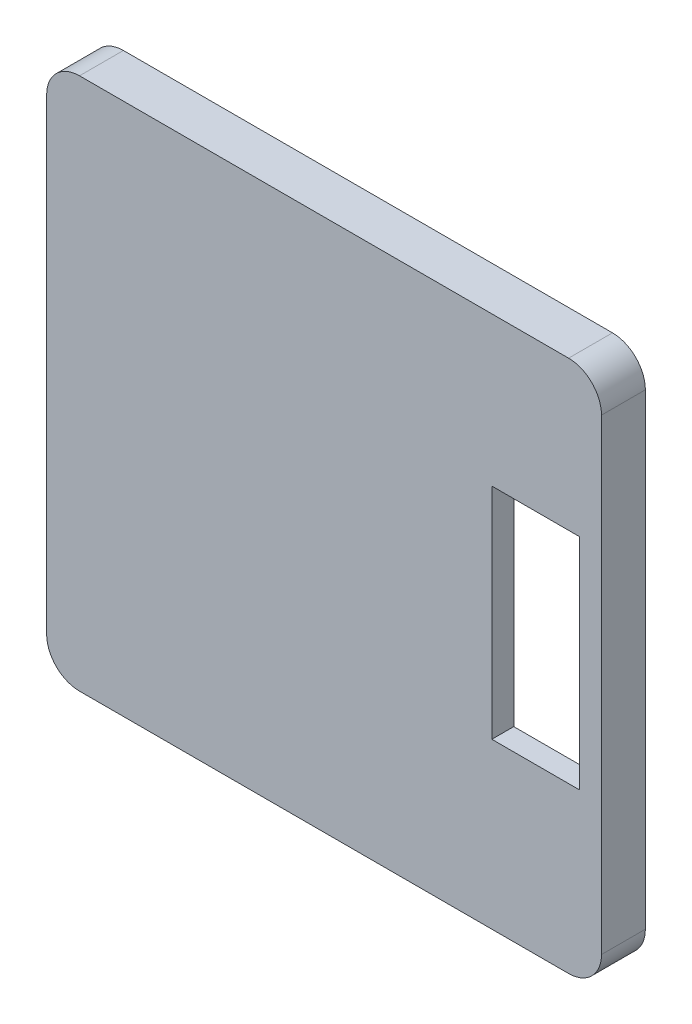
ISO-10303-21;
HEADER;
FILE_DESCRIPTION(('STEP AP214'),'2;1');
FILE_NAME('part.step','',(''),(''),'','','');
FILE_SCHEMA(('AUTOMOTIVE_DESIGN { 1 0 10303 214 1 1 1 1 }'));
ENDSEC;
DATA;
#1=APPLICATION_CONTEXT('core data for automotive mechanical design processes');
#2=APPLICATION_PROTOCOL_DEFINITION('international standard','automotive_design',2000,#1);
#3=PRODUCT_CONTEXT('',#1,'mechanical');
#4=PRODUCT('Part','Part','',(#3));
#5=PRODUCT_RELATED_PRODUCT_CATEGORY('part','',(#4));
#6=PRODUCT_DEFINITION_FORMATION('','',#4);
#7=PRODUCT_DEFINITION_CONTEXT('part definition',#1,'design');
#8=PRODUCT_DEFINITION('design','',#6,#7);
#9=PRODUCT_DEFINITION_SHAPE('','',#8);
#10=(LENGTH_UNIT() NAMED_UNIT(*) SI_UNIT(.MILLI.,.METRE.));
#11=(NAMED_UNIT(*) PLANE_ANGLE_UNIT() SI_UNIT($,.RADIAN.));
#12=(NAMED_UNIT(*) SI_UNIT($,.STERADIAN.) SOLID_ANGLE_UNIT());
#13=UNCERTAINTY_MEASURE_WITH_UNIT(LENGTH_MEASURE(1.E-05),#10,'distance_accuracy_value','');
#14=(GEOMETRIC_REPRESENTATION_CONTEXT(3) GLOBAL_UNCERTAINTY_ASSIGNED_CONTEXT((#13)) GLOBAL_UNIT_ASSIGNED_CONTEXT((#10,
#11,#12)) REPRESENTATION_CONTEXT('',''));
#15=CARTESIAN_POINT('',(0.,0.,0.));
#16=DIRECTION('',(0.,0.,1.));
#17=DIRECTION('',(1.,0.,0.));
#18=AXIS2_PLACEMENT_3D('',#15,#16,#17);
#19=CARTESIAN_POINT('',(22.2448262319382,21.8827606520927,2.));
#20=DIRECTION('',(-1.,0.,0.));
#21=DIRECTION('',(0.,0.,1.));
#22=AXIS2_PLACEMENT_3D('',#19,#20,#21);
#23=PLANE('',#22);
#24=DIRECTION('',(0.,0.,1.));
#25=VECTOR('',#24,1.);
#26=CARTESIAN_POINT('',(22.2448262319382,-8.91723934790731,2.));
#27=LINE('',#26,#25);
#28=CARTESIAN_POINT('',(22.2448262319382,-8.91723934790731,-2.));
#29=VERTEX_POINT('',#28);
#30=CARTESIAN_POINT('',(22.2448262319382,-8.91723934790731,-1.));
#31=VERTEX_POINT('',#30);
#32=EDGE_CURVE('E268',#29,#31,#27,.T.);
#33=ORIENTED_EDGE('',*,*,#32,.F.);
#34=DIRECTION('',(0.,1.,0.));
#35=VECTOR('',#34,1.);
#36=CARTESIAN_POINT('',(22.2448262319382,21.8827606520927,-2.));
#37=LINE('',#36,#35);
#38=CARTESIAN_POINT('',(22.2448262319382,-17.1172393479073,-2.));
#39=VERTEX_POINT('',#38);
#40=EDGE_CURVE('E303',#39,#29,#37,.T.);
#41=ORIENTED_EDGE('',*,*,#40,.F.);
#42=DIRECTION('',(0.,0.,-1.));
#43=VECTOR('',#42,1.);
#44=CARTESIAN_POINT('',(22.2448262319382,-17.1172393479073,0.));
#45=LINE('',#44,#43);
#46=CARTESIAN_POINT('',(22.2448262319382,-17.1172393479073,-1.));
#47=VERTEX_POINT('',#46);
#48=EDGE_CURVE('E383',#39,#47,#45,.F.);
#49=ORIENTED_EDGE('',*,*,#48,.T.);
#50=DIRECTION('',(0.,-1.,0.));
#51=VECTOR('',#50,1.);
#52=CARTESIAN_POINT('',(22.2448262319382,21.8827606520927,-0.999999999999995));
#53=LINE('',#52,#51);
#54=EDGE_CURVE('E377',#47,#31,#53,.F.);
#55=ORIENTED_EDGE('',*,*,#54,.T.);
#56=EDGE_LOOP('',(#33,#41,#49,#55));
#57=FACE_BOUND('',#56,.T.);
#58=ADVANCED_FACE('F33',(#57),#23,.T.);
#59=CARTESIAN_POINT('',(21.2448262319382,21.8827606520927,-0.999999999999995));
#60=DIRECTION('',(0.,-1.,0.));
#61=DIRECTION('',(0.,0.,-1.));
#62=AXIS2_PLACEMENT_3D('',#59,#60,#61);
#63=CYLINDRICAL_SURFACE('',#62,1.);
#64=DIRECTION('',(0.,-1.,0.));
#65=VECTOR('',#64,1.);
#66=CARTESIAN_POINT('',(21.2448262319382,21.8827606520927,0.));
#67=LINE('',#66,#65);
#68=CARTESIAN_POINT('',(21.2448262319382,-8.91723934790731,0.));
#69=VERTEX_POINT('',#68);
#70=CARTESIAN_POINT('',(21.2448262319382,-17.1172393479073,0.));
#71=VERTEX_POINT('',#70);
#72=EDGE_CURVE('E385',#69,#71,#67,.T.);
#73=ORIENTED_EDGE('',*,*,#72,.F.);
#74=CARTESIAN_POINT('',(21.2448262319382,-8.91723934790731,-1.));
#75=DIRECTION('',(0.,-1.,0.));
#76=DIRECTION('',(1.,0.,0.));
#77=AXIS2_PLACEMENT_3D('',#74,#75,#76);
#78=CIRCLE('',#77,1.);
#79=EDGE_CURVE('E463',#69,#31,#78,.F.);
#80=ORIENTED_EDGE('',*,*,#79,.T.);
#81=ORIENTED_EDGE('',*,*,#54,.F.);
#82=CARTESIAN_POINT('',(21.2448262319382,-17.1172393479073,-1.));
#83=DIRECTION('',(0.,1.,0.));
#84=DIRECTION('',(0.,0.,1.));
#85=AXIS2_PLACEMENT_3D('',#82,#83,#84);
#86=CIRCLE('',#85,1.);
#87=EDGE_CURVE('E427',#71,#47,#86,.T.);
#88=ORIENTED_EDGE('',*,*,#87,.F.);
#89=EDGE_LOOP('',(#73,#80,#81,#88));
#90=FACE_BOUND('',#89,.T.);
#91=ADVANCED_FACE('F502',(#90),#63,.F.);
#92=CARTESIAN_POINT('',(-22.7551737680618,21.8827606520927,2.));
#93=DIRECTION('',(1.,0.,0.));
#94=DIRECTION('',(0.,0.,-1.));
#95=AXIS2_PLACEMENT_3D('',#92,#93,#94);
#96=PLANE('',#95);
#97=DIRECTION('',(0.,0.,1.));
#98=VECTOR('',#97,1.);
#99=CARTESIAN_POINT('',(-22.7551737680618,6.08276065209269,2.));
#100=LINE('',#99,#98);
#101=CARTESIAN_POINT('',(-22.7551737680618,6.08276065209269,-2.));
#102=VERTEX_POINT('',#101);
#103=CARTESIAN_POINT('',(-22.7551737680618,6.08276065209269,-1.));
#104=VERTEX_POINT('',#103);
#105=EDGE_CURVE('E292',#102,#104,#100,.T.);
#106=ORIENTED_EDGE('',*,*,#105,.F.);
#107=DIRECTION('',(0.,-1.,0.));
#108=VECTOR('',#107,1.);
#109=CARTESIAN_POINT('',(-22.7551737680618,21.8827606520927,-2.));
#110=LINE('',#109,#108);
#111=CARTESIAN_POINT('',(-22.7551737680618,20.8827606520927,-2.));
#112=VERTEX_POINT('',#111);
#113=EDGE_CURVE('E295',#112,#102,#110,.T.);
#114=ORIENTED_EDGE('',*,*,#113,.F.);
#115=DIRECTION('',(0.,0.,-1.));
#116=VECTOR('',#115,1.);
#117=CARTESIAN_POINT('',(-22.7551737680618,20.8827606520927,0.));
#118=LINE('',#117,#116);
#119=CARTESIAN_POINT('',(-22.7551737680618,20.8827606520927,-0.999999999999995));
#120=VERTEX_POINT('',#119);
#121=EDGE_CURVE('E402',#112,#120,#118,.F.);
#122=ORIENTED_EDGE('',*,*,#121,.T.);
#123=DIRECTION('',(0.,1.,0.));
#124=VECTOR('',#123,1.);
#125=CARTESIAN_POINT('',(-22.7551737680618,21.8827606520927,-0.999999999999995));
#126=LINE('',#125,#124);
#127=EDGE_CURVE('E399',#120,#104,#126,.F.);
#128=ORIENTED_EDGE('',*,*,#127,.T.);
#129=EDGE_LOOP('',(#106,#114,#122,#128));
#130=FACE_BOUND('',#129,.T.);
#131=ADVANCED_FACE('F534',(#130),#96,.T.);
#132=CARTESIAN_POINT('',(-21.7551737680618,21.8827606520927,-0.999999999999995));
#133=DIRECTION('',(0.,1.,0.));
#134=DIRECTION('',(0.,0.,1.));
#135=AXIS2_PLACEMENT_3D('',#132,#133,#134);
#136=CYLINDRICAL_SURFACE('',#135,1.);
#137=DIRECTION('',(0.,1.,0.));
#138=VECTOR('',#137,1.);
#139=CARTESIAN_POINT('',(-21.7551737680618,21.8827606520927,0.));
#140=LINE('',#139,#138);
#141=CARTESIAN_POINT('',(-21.7551737680618,6.08276065209269,0.));
#142=VERTEX_POINT('',#141);
#143=CARTESIAN_POINT('',(-21.7551737680618,20.8827606520927,0.));
#144=VERTEX_POINT('',#143);
#145=EDGE_CURVE('E391',#142,#144,#140,.T.);
#146=ORIENTED_EDGE('',*,*,#145,.F.);
#147=CARTESIAN_POINT('',(-21.7551737680618,6.08276065209269,-0.999999999999999));
#148=DIRECTION('',(0.,1.,0.));
#149=DIRECTION('',(0.,0.,1.));
#150=AXIS2_PLACEMENT_3D('',#147,#148,#149);
#151=CIRCLE('',#150,1.);
#152=EDGE_CURVE('E458',#142,#104,#151,.F.);
#153=ORIENTED_EDGE('',*,*,#152,.T.);
#154=ORIENTED_EDGE('',*,*,#127,.F.);
#155=CARTESIAN_POINT('',(-21.7551737680618,20.8827606520927,-0.999999999999995));
#156=DIRECTION('',(0.,-1.,0.));
#157=DIRECTION('',(0.,0.,-1.));
#158=AXIS2_PLACEMENT_3D('',#155,#156,#157);
#159=CIRCLE('',#158,1.);
#160=EDGE_CURVE('E447',#120,#144,#159,.F.);
#161=ORIENTED_EDGE('',*,*,#160,.T.);
#162=EDGE_LOOP('',(#146,#153,#154,#161));
#163=FACE_BOUND('',#162,.T.);
#164=ADVANCED_FACE('F545',(#163),#136,.F.);
#165=DIRECTION('',(0.,0.,-1.));
#166=VECTOR('',#165,1.);
#167=CARTESIAN_POINT('',(-22.7551737680618,-6.91723934790731,2.));
#168=LINE('',#167,#166);
#169=CARTESIAN_POINT('',(-22.7551737680618,-6.91723934790731,-1.));
#170=VERTEX_POINT('',#169);
#171=CARTESIAN_POINT('',(-22.7551737680618,-6.91723934790731,-2.));
#172=VERTEX_POINT('',#171);
#173=EDGE_CURVE('E285',#170,#172,#168,.T.);
#174=ORIENTED_EDGE('',*,*,#173,.F.);
#175=CARTESIAN_POINT('',(-22.7551737680618,-17.1172393479073,-1.));
#176=VERTEX_POINT('',#175);
#177=EDGE_CURVE('E398',#170,#176,#126,.F.);
#178=ORIENTED_EDGE('',*,*,#177,.T.);
#179=DIRECTION('',(0.,0.,-1.));
#180=VECTOR('',#179,1.);
#181=CARTESIAN_POINT('',(-22.7551737680618,-17.1172393479073,-2.));
#182=LINE('',#181,#180);
#183=CARTESIAN_POINT('',(-22.7551737680618,-17.1172393479073,-2.));
#184=VERTEX_POINT('',#183);
#185=EDGE_CURVE('E404',#176,#184,#182,.T.);
#186=ORIENTED_EDGE('',*,*,#185,.T.);
#187=EDGE_CURVE('E299',#172,#184,#110,.T.);
#188=ORIENTED_EDGE('',*,*,#187,.F.);
#189=EDGE_LOOP('',(#174,#178,#186,#188));
#190=FACE_BOUND('',#189,.T.);
#191=ADVANCED_FACE('F547',(#190),#96,.T.);
#192=CARTESIAN_POINT('',(-22.7551737680618,-18.1172393479073,2.));
#193=DIRECTION('',(0.,1.,0.));
#194=DIRECTION('',(0.,0.,1.));
#195=AXIS2_PLACEMENT_3D('',#192,#193,#194);
#196=PLANE('',#195);
#197=DIRECTION('',(1.,0.,0.));
#198=VECTOR('',#197,1.);
#199=CARTESIAN_POINT('',(-22.7551737680618,-18.1172393479073,-1.));
#200=LINE('',#199,#198);
#201=CARTESIAN_POINT('',(-21.7551737680618,-18.1172393479073,-1.));
#202=VERTEX_POINT('',#201);
#203=CARTESIAN_POINT('',(21.2448262319382,-18.1172393479073,-1.));
#204=VERTEX_POINT('',#203);
#205=EDGE_CURVE('E371',#202,#204,#200,.T.);
#206=ORIENTED_EDGE('',*,*,#205,.T.);
#207=DIRECTION('',(0.,0.,-1.));
#208=VECTOR('',#207,1.);
#209=CARTESIAN_POINT('',(21.2448262319382,-18.1172393479073,-2.));
#210=LINE('',#209,#208);
#211=CARTESIAN_POINT('',(21.2448262319382,-18.1172393479073,-2.));
#212=VERTEX_POINT('',#211);
#213=EDGE_CURVE('E373',#204,#212,#210,.T.);
#214=ORIENTED_EDGE('',*,*,#213,.T.);
#215=DIRECTION('',(1.,0.,0.));
#216=VECTOR('',#215,1.);
#217=CARTESIAN_POINT('',(-22.7551737680618,-18.1172393479073,-2.));
#218=LINE('',#217,#216);
#219=CARTESIAN_POINT('',(-21.7551737680618,-18.1172393479073,-2.));
#220=VERTEX_POINT('',#219);
#221=EDGE_CURVE('E298',#220,#212,#218,.T.);
#222=ORIENTED_EDGE('',*,*,#221,.F.);
#223=DIRECTION('',(0.,0.,-1.));
#224=VECTOR('',#223,1.);
#225=CARTESIAN_POINT('',(-21.7551737680618,-18.1172393479073,0.));
#226=LINE('',#225,#224);
#227=EDGE_CURVE('E369',#220,#202,#226,.F.);
#228=ORIENTED_EDGE('',*,*,#227,.T.);
#229=EDGE_LOOP('',(#206,#214,#222,#228));
#230=FACE_BOUND('',#229,.T.);
#231=ADVANCED_FACE('F553',(#230),#196,.T.);
#232=DIRECTION('',(0.,0.,-1.));
#233=VECTOR('',#232,1.);
#234=CARTESIAN_POINT('',(22.2448262319382,11.0827606520927,2.));
#235=LINE('',#234,#233);
#236=CARTESIAN_POINT('',(22.2448262319382,11.0827606520927,-1.));
#237=VERTEX_POINT('',#236);
#238=CARTESIAN_POINT('',(22.2448262319382,11.0827606520927,-2.));
#239=VERTEX_POINT('',#238);
#240=EDGE_CURVE('E260',#237,#239,#235,.T.);
#241=ORIENTED_EDGE('',*,*,#240,.F.);
#242=CARTESIAN_POINT('',(22.2448262319382,20.8827606520927,-0.999999999999995));
#243=VERTEX_POINT('',#242);
#244=EDGE_CURVE('E376',#237,#243,#53,.F.);
#245=ORIENTED_EDGE('',*,*,#244,.T.);
#246=DIRECTION('',(0.,0.,-1.));
#247=VECTOR('',#246,1.);
#248=CARTESIAN_POINT('',(22.2448262319382,20.8827606520927,-2.));
#249=LINE('',#248,#247);
#250=CARTESIAN_POINT('',(22.2448262319382,20.8827606520927,-2.));
#251=VERTEX_POINT('',#250);
#252=EDGE_CURVE('E380',#243,#251,#249,.T.);
#253=ORIENTED_EDGE('',*,*,#252,.T.);
#254=EDGE_CURVE('E302',#239,#251,#37,.T.);
#255=ORIENTED_EDGE('',*,*,#254,.F.);
#256=EDGE_LOOP('',(#241,#245,#253,#255));
#257=FACE_BOUND('',#256,.T.);
#258=ADVANCED_FACE('F478',(#257),#23,.T.);
#259=CARTESIAN_POINT('',(-22.7551737680618,21.8827606520927,2.));
#260=DIRECTION('',(0.,-1.,0.));
#261=DIRECTION('',(0.,0.,-1.));
#262=AXIS2_PLACEMENT_3D('',#259,#260,#261);
#263=PLANE('',#262);
#264=DIRECTION('',(-1.,0.,0.));
#265=VECTOR('',#264,1.);
#266=CARTESIAN_POINT('',(-22.7551737680618,21.8827606520927,-0.999999999999995));
#267=LINE('',#266,#265);
#268=CARTESIAN_POINT('',(21.2448262319382,21.8827606520927,-0.999999999999995));
#269=VERTEX_POINT('',#268);
#270=CARTESIAN_POINT('',(-21.7551737680618,21.8827606520927,-0.999999999999995));
#271=VERTEX_POINT('',#270);
#272=EDGE_CURVE('E407',#269,#271,#267,.T.);
#273=ORIENTED_EDGE('',*,*,#272,.T.);
#274=DIRECTION('',(0.,0.,-1.));
#275=VECTOR('',#274,1.);
#276=CARTESIAN_POINT('',(-21.7551737680618,21.8827606520927,-2.));
#277=LINE('',#276,#275);
#278=CARTESIAN_POINT('',(-21.7551737680618,21.8827606520927,-2.));
#279=VERTEX_POINT('',#278);
#280=EDGE_CURVE('E411',#271,#279,#277,.T.);
#281=ORIENTED_EDGE('',*,*,#280,.T.);
#282=DIRECTION('',(-1.,0.,0.));
#283=VECTOR('',#282,1.);
#284=CARTESIAN_POINT('',(-22.7551737680618,21.8827606520927,-2.));
#285=LINE('',#284,#283);
#286=CARTESIAN_POINT('',(21.2448262319382,21.8827606520927,-2.));
#287=VERTEX_POINT('',#286);
#288=EDGE_CURVE('E306',#287,#279,#285,.T.);
#289=ORIENTED_EDGE('',*,*,#288,.F.);
#290=DIRECTION('',(0.,0.,-1.));
#291=VECTOR('',#290,1.);
#292=CARTESIAN_POINT('',(21.2448262319382,21.8827606520927,0.));
#293=LINE('',#292,#291);
#294=EDGE_CURVE('E409',#287,#269,#293,.F.);
#295=ORIENTED_EDGE('',*,*,#294,.T.);
#296=EDGE_LOOP('',(#273,#281,#289,#295));
#297=FACE_BOUND('',#296,.T.);
#298=ADVANCED_FACE('F570',(#297),#263,.T.);
#299=CARTESIAN_POINT('',(-22.5551737680618,21.6827606520927,2.));
#300=DIRECTION('',(0.,0.,1.));
#301=DIRECTION('',(1.,0.,0.));
#302=AXIS2_PLACEMENT_3D('',#299,#300,#301);
#303=PLANE('',#302);
#304=DIRECTION('',(0.,1.,0.));
#305=VECTOR('',#304,1.);
#306=CARTESIAN_POINT('',(23.0448262319382,-8.91723934790731,2.));
#307=LINE('',#306,#305);
#308=CARTESIAN_POINT('',(23.0448262319382,-8.91723934790731,2.));
#309=VERTEX_POINT('',#308);
#310=CARTESIAN_POINT('',(23.0448262319382,11.0827606520927,2.));
#311=VERTEX_POINT('',#310);
#312=EDGE_CURVE('E48',#309,#311,#307,.T.);
#313=ORIENTED_EDGE('',*,*,#312,.F.);
#314=DIRECTION('',(1.,0.,0.));
#315=VECTOR('',#314,1.);
#316=CARTESIAN_POINT('',(23.0448262319382,-8.91723934790731,2.));
#317=LINE('',#316,#315);
#318=CARTESIAN_POINT('',(15.0448262319382,-8.91723934790731,2.));
#319=VERTEX_POINT('',#318);
#320=EDGE_CURVE('E250',#319,#309,#317,.T.);
#321=ORIENTED_EDGE('',*,*,#320,.F.);
#322=DIRECTION('',(0.,-1.,0.));
#323=VECTOR('',#322,1.);
#324=CARTESIAN_POINT('',(15.0448262319382,-8.91723934790731,2.));
#325=LINE('',#324,#323);
#326=CARTESIAN_POINT('',(15.0448262319382,11.0827606520927,2.));
#327=VERTEX_POINT('',#326);
#328=EDGE_CURVE('E236',#327,#319,#325,.T.);
#329=ORIENTED_EDGE('',*,*,#328,.F.);
#330=DIRECTION('',(-1.,0.,0.));
#331=VECTOR('',#330,1.);
#332=CARTESIAN_POINT('',(23.0448262319382,11.0827606520927,2.));
#333=LINE('',#332,#331);
#334=EDGE_CURVE('E243',#311,#327,#333,.T.);
#335=ORIENTED_EDGE('',*,*,#334,.F.);
#336=EDGE_LOOP('',(#313,#321,#329,#335));
#337=FACE_BOUND('',#336,.T.);
#338=CARTESIAN_POINT('',(-22.5551737680618,21.6827606520927,2.));
#339=DIRECTION('',(0.,0.,1.));
#340=DIRECTION('',(1.,0.,0.));
#341=AXIS2_PLACEMENT_3D('',#338,#339,#340);
#342=CIRCLE('',#341,3.);
#343=CARTESIAN_POINT('',(-22.5551737680618,24.6827606520927,2.));
#344=VERTEX_POINT('',#343);
#345=CARTESIAN_POINT('',(-25.5551737680618,21.6827606520927,2.));
#346=VERTEX_POINT('',#345);
#347=EDGE_CURVE('E310',#344,#346,#342,.T.);
#348=ORIENTED_EDGE('',*,*,#347,.T.);
#349=DIRECTION('',(0.,-1.,0.));
#350=VECTOR('',#349,1.);
#351=CARTESIAN_POINT('',(-25.5551737680618,21.6827606520927,2.));
#352=LINE('',#351,#350);
#353=CARTESIAN_POINT('',(-25.5551737680618,-20.9172393479073,2.));
#354=VERTEX_POINT('',#353);
#355=EDGE_CURVE('E313',#346,#354,#352,.T.);
#356=ORIENTED_EDGE('',*,*,#355,.T.);
#357=CARTESIAN_POINT('',(-22.5551737680618,-20.9172393479073,2.));
#358=DIRECTION('',(0.,0.,1.));
#359=DIRECTION('',(1.,0.,0.));
#360=AXIS2_PLACEMENT_3D('',#357,#358,#359);
#361=CIRCLE('',#360,3.);
#362=CARTESIAN_POINT('',(-22.5551737680618,-23.9172393479073,2.));
#363=VERTEX_POINT('',#362);
#364=EDGE_CURVE('E316',#354,#363,#361,.T.);
#365=ORIENTED_EDGE('',*,*,#364,.T.);
#366=DIRECTION('',(1.,0.,0.));
#367=VECTOR('',#366,1.);
#368=CARTESIAN_POINT('',(-22.5551737680618,-23.9172393479073,2.));
#369=LINE('',#368,#367);
#370=CARTESIAN_POINT('',(22.0448262319382,-23.9172393479072,2.));
#371=VERTEX_POINT('',#370);
#372=EDGE_CURVE('E318',#363,#371,#369,.T.);
#373=ORIENTED_EDGE('',*,*,#372,.T.);
#374=CARTESIAN_POINT('',(22.0448262319382,-20.9172393479072,2.));
#375=DIRECTION('',(0.,0.,1.));
#376=DIRECTION('',(1.,0.,0.));
#377=AXIS2_PLACEMENT_3D('',#374,#375,#376);
#378=CIRCLE('',#377,3.);
#379=CARTESIAN_POINT('',(25.0448262319382,-20.9172393479072,2.));
#380=VERTEX_POINT('',#379);
#381=EDGE_CURVE('E320',#371,#380,#378,.T.);
#382=ORIENTED_EDGE('',*,*,#381,.T.);
#383=DIRECTION('',(0.,1.,0.));
#384=VECTOR('',#383,1.);
#385=CARTESIAN_POINT('',(25.0448262319382,-20.9172393479072,2.));
#386=LINE('',#385,#384);
#387=CARTESIAN_POINT('',(25.0448262319382,21.6827606520927,2.));
#388=VERTEX_POINT('',#387);
#389=EDGE_CURVE('E322',#380,#388,#386,.T.);
#390=ORIENTED_EDGE('',*,*,#389,.T.);
#391=CARTESIAN_POINT('',(22.0448262319382,21.6827606520927,2.));
#392=DIRECTION('',(0.,0.,1.));
#393=DIRECTION('',(1.,0.,0.));
#394=AXIS2_PLACEMENT_3D('',#391,#392,#393);
#395=CIRCLE('',#394,3.);
#396=CARTESIAN_POINT('',(22.0448262319382,24.6827606520927,2.));
#397=VERTEX_POINT('',#396);
#398=EDGE_CURVE('E324',#388,#397,#395,.T.);
#399=ORIENTED_EDGE('',*,*,#398,.T.);
#400=DIRECTION('',(-1.,0.,0.));
#401=VECTOR('',#400,1.);
#402=CARTESIAN_POINT('',(22.0448262319382,24.6827606520927,2.));
#403=LINE('',#402,#401);
#404=EDGE_CURVE('E326',#397,#344,#403,.T.);
#405=ORIENTED_EDGE('',*,*,#404,.T.);
#406=EDGE_LOOP('',(#348,#356,#365,#373,#382,#390,#399,#405));
#407=FACE_BOUND('',#406,.T.);
#408=ADVANCED_FACE('F247',(#337,#407),#303,.T.);
#409=CARTESIAN_POINT('',(-22.5551737680618,21.6827606520927,-2.));
#410=DIRECTION('',(0.,0.,1.));
#411=DIRECTION('',(1.,0.,0.));
#412=AXIS2_PLACEMENT_3D('',#409,#410,#411);
#413=PLANE('',#412);
#414=ORIENTED_EDGE('',*,*,#40,.T.);
#415=DIRECTION('',(1.,0.,0.));
#416=VECTOR('',#415,1.);
#417=CARTESIAN_POINT('',(-22.5551737680618,-8.91723934790732,-2.));
#418=LINE('',#417,#416);
#419=CARTESIAN_POINT('',(23.0448262319382,-8.91723934790731,-2.));
#420=VERTEX_POINT('',#419);
#421=EDGE_CURVE('E270',#29,#420,#418,.T.);
#422=ORIENTED_EDGE('',*,*,#421,.T.);
#423=DIRECTION('',(0.,1.,0.));
#424=VECTOR('',#423,1.);
#425=CARTESIAN_POINT('',(23.0448262319382,21.6827606520927,-2.));
#426=LINE('',#425,#424);
#427=CARTESIAN_POINT('',(23.0448262319382,11.0827606520927,-2.));
#428=VERTEX_POINT('',#427);
#429=EDGE_CURVE('E11',#420,#428,#426,.T.);
#430=ORIENTED_EDGE('',*,*,#429,.T.);
#431=DIRECTION('',(-1.,0.,0.));
#432=VECTOR('',#431,1.);
#433=CARTESIAN_POINT('',(-22.5551737680618,11.0827606520927,-2.));
#434=LINE('',#433,#432);
#435=EDGE_CURVE('E262',#428,#239,#434,.T.);
#436=ORIENTED_EDGE('',*,*,#435,.T.);
#437=ORIENTED_EDGE('',*,*,#254,.T.);
#438=CARTESIAN_POINT('',(21.2448262319382,20.8827606520927,-2.));
#439=DIRECTION('',(0.,0.,1.));
#440=DIRECTION('',(1.,0.,0.));
#441=AXIS2_PLACEMENT_3D('',#438,#439,#440);
#442=CIRCLE('',#441,1.);
#443=EDGE_CURVE('E419',#251,#287,#442,.T.);
#444=ORIENTED_EDGE('',*,*,#443,.T.);
#445=ORIENTED_EDGE('',*,*,#288,.T.);
#446=CARTESIAN_POINT('',(-21.7551737680618,20.8827606520927,-2.));
#447=DIRECTION('',(0.,0.,1.));
#448=DIRECTION('',(1.,0.,0.));
#449=AXIS2_PLACEMENT_3D('',#446,#447,#448);
#450=CIRCLE('',#449,1.);
#451=EDGE_CURVE('E417',#279,#112,#450,.T.);
#452=ORIENTED_EDGE('',*,*,#451,.T.);
#453=ORIENTED_EDGE('',*,*,#113,.T.);
#454=DIRECTION('',(-1.,0.,0.));
#455=VECTOR('',#454,1.);
#456=CARTESIAN_POINT('',(-14.5551737680618,6.08276065209269,-2.));
#457=LINE('',#456,#455);
#458=CARTESIAN_POINT('',(-25.5551737680618,6.08276065209269,-2.));
#459=VERTEX_POINT('',#458);
#460=EDGE_CURVE('E282',#102,#459,#457,.T.);
#461=ORIENTED_EDGE('',*,*,#460,.T.);
#462=DIRECTION('',(0.,-1.,0.));
#463=VECTOR('',#462,1.);
#464=CARTESIAN_POINT('',(-25.5551737680618,21.6827606520927,-2.));
#465=LINE('',#464,#463);
#466=CARTESIAN_POINT('',(-25.5551737680618,21.6827606520927,-2.));
#467=VERTEX_POINT('',#466);
#468=EDGE_CURVE('E332',#467,#459,#465,.T.);
#469=ORIENTED_EDGE('',*,*,#468,.F.);
#470=CARTESIAN_POINT('',(-22.5551737680618,21.6827606520927,-2.));
#471=DIRECTION('',(0.,0.,1.));
#472=DIRECTION('',(1.,0.,0.));
#473=AXIS2_PLACEMENT_3D('',#470,#471,#472);
#474=CIRCLE('',#473,3.);
#475=CARTESIAN_POINT('',(-22.5551737680618,24.6827606520927,-2.));
#476=VERTEX_POINT('',#475);
#477=EDGE_CURVE('E309',#476,#467,#474,.T.);
#478=ORIENTED_EDGE('',*,*,#477,.F.);
#479=DIRECTION('',(-1.,0.,0.));
#480=VECTOR('',#479,1.);
#481=CARTESIAN_POINT('',(22.0448262319382,24.6827606520927,-2.));
#482=LINE('',#481,#480);
#483=CARTESIAN_POINT('',(22.0448262319382,24.6827606520927,-2.));
#484=VERTEX_POINT('',#483);
#485=EDGE_CURVE('E314',#484,#476,#482,.T.);
#486=ORIENTED_EDGE('',*,*,#485,.F.);
#487=CARTESIAN_POINT('',(22.0448262319382,21.6827606520927,-2.));
#488=DIRECTION('',(0.,0.,1.));
#489=DIRECTION('',(1.,0.,0.));
#490=AXIS2_PLACEMENT_3D('',#487,#488,#489);
#491=CIRCLE('',#490,3.);
#492=CARTESIAN_POINT('',(25.0448262319382,21.6827606520927,-2.));
#493=VERTEX_POINT('',#492);
#494=EDGE_CURVE('E343',#493,#484,#491,.T.);
#495=ORIENTED_EDGE('',*,*,#494,.F.);
#496=DIRECTION('',(0.,1.,0.));
#497=VECTOR('',#496,1.);
#498=CARTESIAN_POINT('',(25.0448262319382,-20.9172393479072,-2.));
#499=LINE('',#498,#497);
#500=CARTESIAN_POINT('',(25.0448262319382,-20.9172393479072,-2.));
#501=VERTEX_POINT('',#500);
#502=EDGE_CURVE('E341',#501,#493,#499,.T.);
#503=ORIENTED_EDGE('',*,*,#502,.F.);
#504=CARTESIAN_POINT('',(22.0448262319382,-20.9172393479072,-2.));
#505=DIRECTION('',(0.,0.,1.));
#506=DIRECTION('',(1.,0.,0.));
#507=AXIS2_PLACEMENT_3D('',#504,#505,#506);
#508=CIRCLE('',#507,3.);
#509=CARTESIAN_POINT('',(22.0448262319382,-23.9172393479072,-2.));
#510=VERTEX_POINT('',#509);
#511=EDGE_CURVE('E339',#510,#501,#508,.T.);
#512=ORIENTED_EDGE('',*,*,#511,.F.);
#513=DIRECTION('',(1.,0.,0.));
#514=VECTOR('',#513,1.);
#515=CARTESIAN_POINT('',(-22.5551737680618,-23.9172393479073,-2.));
#516=LINE('',#515,#514);
#517=CARTESIAN_POINT('',(-22.5551737680618,-23.9172393479073,-2.));
#518=VERTEX_POINT('',#517);
#519=EDGE_CURVE('E337',#518,#510,#516,.T.);
#520=ORIENTED_EDGE('',*,*,#519,.F.);
#521=CARTESIAN_POINT('',(-22.5551737680618,-20.9172393479073,-2.));
#522=DIRECTION('',(0.,0.,1.));
#523=DIRECTION('',(1.,0.,0.));
#524=AXIS2_PLACEMENT_3D('',#521,#522,#523);
#525=CIRCLE('',#524,3.);
#526=CARTESIAN_POINT('',(-25.5551737680618,-20.9172393479073,-2.));
#527=VERTEX_POINT('',#526);
#528=EDGE_CURVE('E335',#527,#518,#525,.T.);
#529=ORIENTED_EDGE('',*,*,#528,.F.);
#530=CARTESIAN_POINT('',(-25.5551737680618,-6.91723934790731,-2.));
#531=VERTEX_POINT('',#530);
#532=EDGE_CURVE('E331',#531,#527,#465,.T.);
#533=ORIENTED_EDGE('',*,*,#532,.F.);
#534=DIRECTION('',(-1.,0.,0.));
#535=VECTOR('',#534,1.);
#536=CARTESIAN_POINT('',(-14.5551737680618,-6.91723934790731,-2.));
#537=LINE('',#536,#535);
#538=EDGE_CURVE('E281',#172,#531,#537,.T.);
#539=ORIENTED_EDGE('',*,*,#538,.F.);
#540=ORIENTED_EDGE('',*,*,#187,.T.);
#541=CARTESIAN_POINT('',(-21.7551737680618,-17.1172393479073,-2.));
#542=DIRECTION('',(0.,0.,1.));
#543=DIRECTION('',(1.,0.,0.));
#544=AXIS2_PLACEMENT_3D('',#541,#542,#543);
#545=CIRCLE('',#544,1.);
#546=EDGE_CURVE('E415',#184,#220,#545,.T.);
#547=ORIENTED_EDGE('',*,*,#546,.T.);
#548=ORIENTED_EDGE('',*,*,#221,.T.);
#549=CARTESIAN_POINT('',(21.2448262319382,-17.1172393479073,-2.));
#550=DIRECTION('',(0.,0.,1.));
#551=DIRECTION('',(1.,0.,0.));
#552=AXIS2_PLACEMENT_3D('',#549,#550,#551);
#553=CIRCLE('',#552,1.);
#554=EDGE_CURVE('E413',#212,#39,#553,.T.);
#555=ORIENTED_EDGE('',*,*,#554,.T.);
#556=EDGE_LOOP('',(#414,#422,#430,#436,#437,#444,#445,#452,#453,#461,#469,#478,#486,#495,#503,
#512,#520,#529,#533,#539,#540,#547,#548,#555));
#557=FACE_BOUND('',#556,.T.);
#558=ADVANCED_FACE('F482',(#557),#413,.F.);
#559=CARTESIAN_POINT('',(-22.5551737680618,21.6827606520927,2.));
#560=DIRECTION('',(0.,0.,-1.));
#561=DIRECTION('',(-1.,0.,0.));
#562=AXIS2_PLACEMENT_3D('',#559,#560,#561);
#563=CYLINDRICAL_SURFACE('',#562,3.);
#564=ORIENTED_EDGE('',*,*,#477,.T.);
#565=DIRECTION('',(0.,0.,-1.));
#566=VECTOR('',#565,1.);
#567=CARTESIAN_POINT('',(-25.5551737680618,21.6827606520927,2.));
#568=LINE('',#567,#566);
#569=EDGE_CURVE('E366',#346,#467,#568,.T.);
#570=ORIENTED_EDGE('',*,*,#569,.F.);
#571=ORIENTED_EDGE('',*,*,#347,.F.);
#572=DIRECTION('',(0.,0.,-1.));
#573=VECTOR('',#572,1.);
#574=CARTESIAN_POINT('',(-22.5551737680618,24.6827606520927,2.));
#575=LINE('',#574,#573);
#576=EDGE_CURVE('E328',#344,#476,#575,.T.);
#577=ORIENTED_EDGE('',*,*,#576,.T.);
#578=EDGE_LOOP('',(#564,#570,#571,#577));
#579=FACE_BOUND('',#578,.T.);
#580=ADVANCED_FACE('F584',(#579),#563,.T.);
#581=CARTESIAN_POINT('',(-25.5551737680618,21.6827606520927,2.));
#582=DIRECTION('',(1.,0.,0.));
#583=DIRECTION('',(0.,0.,-1.));
#584=AXIS2_PLACEMENT_3D('',#581,#582,#583);
#585=PLANE('',#584);
#586=ORIENTED_EDGE('',*,*,#468,.T.);
#587=DIRECTION('',(0.,0.,-1.));
#588=VECTOR('',#587,1.);
#589=CARTESIAN_POINT('',(-25.5551737680618,6.08276065209269,-2.));
#590=LINE('',#589,#588);
#591=CARTESIAN_POINT('',(-25.5551737680618,6.08276065209269,0.));
#592=VERTEX_POINT('',#591);
#593=EDGE_CURVE('E279',#592,#459,#590,.T.);
#594=ORIENTED_EDGE('',*,*,#593,.F.);
#595=DIRECTION('',(0.,1.,0.));
#596=VECTOR('',#595,1.);
#597=CARTESIAN_POINT('',(-25.5551737680618,6.08276065209269,0.));
#598=LINE('',#597,#596);
#599=CARTESIAN_POINT('',(-25.5551737680618,-6.91723934790731,0.));
#600=VERTEX_POINT('',#599);
#601=EDGE_CURVE('E276',#600,#592,#598,.T.);
#602=ORIENTED_EDGE('',*,*,#601,.F.);
#603=DIRECTION('',(0.,0.,1.));
#604=VECTOR('',#603,1.);
#605=CARTESIAN_POINT('',(-25.5551737680618,-6.91723934790731,-2.));
#606=LINE('',#605,#604);
#607=EDGE_CURVE('E273',#531,#600,#606,.T.);
#608=ORIENTED_EDGE('',*,*,#607,.F.);
#609=ORIENTED_EDGE('',*,*,#532,.T.);
#610=DIRECTION('',(0.,0.,-1.));
#611=VECTOR('',#610,1.);
#612=CARTESIAN_POINT('',(-25.5551737680618,-20.9172393479073,2.));
#613=LINE('',#612,#611);
#614=EDGE_CURVE('E363',#354,#527,#613,.T.);
#615=ORIENTED_EDGE('',*,*,#614,.F.);
#616=ORIENTED_EDGE('',*,*,#355,.F.);
#617=ORIENTED_EDGE('',*,*,#569,.T.);
#618=EDGE_LOOP('',(#586,#594,#602,#608,#609,#615,#616,#617));
#619=FACE_BOUND('',#618,.T.);
#620=ADVANCED_FACE('F525',(#619),#585,.F.);
#621=CARTESIAN_POINT('',(-22.5551737680618,-20.9172393479073,2.));
#622=DIRECTION('',(0.,0.,-1.));
#623=DIRECTION('',(-1.,0.,0.));
#624=AXIS2_PLACEMENT_3D('',#621,#622,#623);
#625=CYLINDRICAL_SURFACE('',#624,3.);
#626=ORIENTED_EDGE('',*,*,#528,.T.);
#627=DIRECTION('',(0.,0.,-1.));
#628=VECTOR('',#627,1.);
#629=CARTESIAN_POINT('',(-22.5551737680618,-23.9172393479073,2.));
#630=LINE('',#629,#628);
#631=EDGE_CURVE('E360',#363,#518,#630,.T.);
#632=ORIENTED_EDGE('',*,*,#631,.F.);
#633=ORIENTED_EDGE('',*,*,#364,.F.);
#634=ORIENTED_EDGE('',*,*,#614,.T.);
#635=EDGE_LOOP('',(#626,#632,#633,#634));
#636=FACE_BOUND('',#635,.T.);
#637=ADVANCED_FACE('F604',(#636),#625,.T.);
#638=CARTESIAN_POINT('',(-22.5551737680618,-23.9172393479073,2.));
#639=DIRECTION('',(0.,1.,0.));
#640=DIRECTION('',(-1.,0.,0.));
#641=AXIS2_PLACEMENT_3D('',#638,#639,#640);
#642=PLANE('',#641);
#643=ORIENTED_EDGE('',*,*,#519,.T.);
#644=DIRECTION('',(0.,0.,-1.));
#645=VECTOR('',#644,1.);
#646=CARTESIAN_POINT('',(22.0448262319382,-23.9172393479072,2.));
#647=LINE('',#646,#645);
#648=EDGE_CURVE('E357',#371,#510,#647,.T.);
#649=ORIENTED_EDGE('',*,*,#648,.F.);
#650=ORIENTED_EDGE('',*,*,#372,.F.);
#651=ORIENTED_EDGE('',*,*,#631,.T.);
#652=EDGE_LOOP('',(#643,#649,#650,#651));
#653=FACE_BOUND('',#652,.T.);
#654=ADVANCED_FACE('F600',(#653),#642,.F.);
#655=CARTESIAN_POINT('',(22.0448262319382,-20.9172393479072,2.));
#656=DIRECTION('',(0.,0.,-1.));
#657=DIRECTION('',(-1.,0.,0.));
#658=AXIS2_PLACEMENT_3D('',#655,#656,#657);
#659=CYLINDRICAL_SURFACE('',#658,3.);
#660=ORIENTED_EDGE('',*,*,#511,.T.);
#661=DIRECTION('',(0.,0.,-1.));
#662=VECTOR('',#661,1.);
#663=CARTESIAN_POINT('',(25.0448262319382,-20.9172393479072,2.));
#664=LINE('',#663,#662);
#665=EDGE_CURVE('E354',#380,#501,#664,.T.);
#666=ORIENTED_EDGE('',*,*,#665,.F.);
#667=ORIENTED_EDGE('',*,*,#381,.F.);
#668=ORIENTED_EDGE('',*,*,#648,.T.);
#669=EDGE_LOOP('',(#660,#666,#667,#668));
#670=FACE_BOUND('',#669,.T.);
#671=ADVANCED_FACE('F596',(#670),#659,.T.);
#672=CARTESIAN_POINT('',(25.0448262319382,-20.9172393479072,2.));
#673=DIRECTION('',(-1.,0.,0.));
#674=DIRECTION('',(0.,-1.,0.));
#675=AXIS2_PLACEMENT_3D('',#672,#673,#674);
#676=PLANE('',#675);
#677=ORIENTED_EDGE('',*,*,#502,.T.);
#678=DIRECTION('',(0.,0.,-1.));
#679=VECTOR('',#678,1.);
#680=CARTESIAN_POINT('',(25.0448262319382,21.6827606520927,2.));
#681=LINE('',#680,#679);
#682=EDGE_CURVE('E351',#388,#493,#681,.T.);
#683=ORIENTED_EDGE('',*,*,#682,.F.);
#684=ORIENTED_EDGE('',*,*,#389,.F.);
#685=ORIENTED_EDGE('',*,*,#665,.T.);
#686=EDGE_LOOP('',(#677,#683,#684,#685));
#687=FACE_BOUND('',#686,.T.);
#688=ADVANCED_FACE('F592',(#687),#676,.F.);
#689=CARTESIAN_POINT('',(22.0448262319382,21.6827606520927,2.));
#690=DIRECTION('',(0.,0.,-1.));
#691=DIRECTION('',(-1.,0.,0.));
#692=AXIS2_PLACEMENT_3D('',#689,#690,#691);
#693=CYLINDRICAL_SURFACE('',#692,3.);
#694=ORIENTED_EDGE('',*,*,#494,.T.);
#695=DIRECTION('',(0.,0.,-1.));
#696=VECTOR('',#695,1.);
#697=CARTESIAN_POINT('',(22.0448262319382,24.6827606520927,2.));
#698=LINE('',#697,#696);
#699=EDGE_CURVE('E348',#397,#484,#698,.T.);
#700=ORIENTED_EDGE('',*,*,#699,.F.);
#701=ORIENTED_EDGE('',*,*,#398,.F.);
#702=ORIENTED_EDGE('',*,*,#682,.T.);
#703=EDGE_LOOP('',(#694,#700,#701,#702));
#704=FACE_BOUND('',#703,.T.);
#705=ADVANCED_FACE('F588',(#704),#693,.T.);
#706=CARTESIAN_POINT('',(22.0448262319382,24.6827606520927,2.));
#707=DIRECTION('',(0.,-1.,0.));
#708=DIRECTION('',(0.,0.,-1.));
#709=AXIS2_PLACEMENT_3D('',#706,#707,#708);
#710=PLANE('',#709);
#711=ORIENTED_EDGE('',*,*,#485,.T.);
#712=ORIENTED_EDGE('',*,*,#576,.F.);
#713=ORIENTED_EDGE('',*,*,#404,.F.);
#714=ORIENTED_EDGE('',*,*,#699,.T.);
#715=EDGE_LOOP('',(#711,#712,#713,#714));
#716=FACE_BOUND('',#715,.T.);
#717=ADVANCED_FACE('F585',(#716),#710,.F.);
#718=CARTESIAN_POINT('',(65.0915297224051,21.8827606520927,0.));
#719=DIRECTION('',(0.,0.,1.));
#720=DIRECTION('',(0.,-1.,0.));
#721=AXIS2_PLACEMENT_3D('',#718,#719,#720);
#722=PLANE('',#721);
#723=DIRECTION('',(0.,-1.,0.));
#724=VECTOR('',#723,1.);
#725=CARTESIAN_POINT('',(15.0448262319382,21.8827606520927,0.));
#726=LINE('',#725,#724);
#727=CARTESIAN_POINT('',(15.0448262319382,11.0827606520927,0.));
#728=VERTEX_POINT('',#727);
#729=CARTESIAN_POINT('',(15.0448262319382,-8.91723934790731,0.));
#730=VERTEX_POINT('',#729);
#731=EDGE_CURVE('E41',#728,#730,#726,.T.);
#732=ORIENTED_EDGE('',*,*,#731,.T.);
#733=DIRECTION('',(1.,0.,0.));
#734=VECTOR('',#733,1.);
#735=CARTESIAN_POINT('',(65.0915297224051,-8.9172393479073,0.));
#736=LINE('',#735,#734);
#737=EDGE_CURVE('E265',#730,#69,#736,.T.);
#738=ORIENTED_EDGE('',*,*,#737,.T.);
#739=ORIENTED_EDGE('',*,*,#72,.T.);
#740=DIRECTION('',(1.,0.,0.));
#741=VECTOR('',#740,1.);
#742=CARTESIAN_POINT('',(65.0915297224051,-17.1172393479073,0.));
#743=LINE('',#742,#741);
#744=CARTESIAN_POINT('',(-21.7551737680618,-17.1172393479073,0.));
#745=VERTEX_POINT('',#744);
#746=EDGE_CURVE('E395',#71,#745,#743,.F.);
#747=ORIENTED_EDGE('',*,*,#746,.T.);
#748=CARTESIAN_POINT('',(-21.7551737680618,-6.91723934790731,0.));
#749=VERTEX_POINT('',#748);
#750=EDGE_CURVE('E392',#745,#749,#140,.T.);
#751=ORIENTED_EDGE('',*,*,#750,.T.);
#752=DIRECTION('',(-1.,0.,0.));
#753=VECTOR('',#752,1.);
#754=CARTESIAN_POINT('',(-14.5551737680618,-6.91723934790731,0.));
#755=LINE('',#754,#753);
#756=EDGE_CURVE('E288',#749,#600,#755,.T.);
#757=ORIENTED_EDGE('',*,*,#756,.T.);
#758=ORIENTED_EDGE('',*,*,#601,.T.);
#759=DIRECTION('',(-1.,0.,0.));
#760=VECTOR('',#759,1.);
#761=CARTESIAN_POINT('',(-14.5551737680618,6.08276065209269,0.));
#762=LINE('',#761,#760);
#763=EDGE_CURVE('E286',#142,#592,#762,.T.);
#764=ORIENTED_EDGE('',*,*,#763,.F.);
#765=ORIENTED_EDGE('',*,*,#145,.T.);
#766=DIRECTION('',(-1.,0.,0.));
#767=VECTOR('',#766,1.);
#768=CARTESIAN_POINT('',(65.0915297224051,20.8827606520927,0.));
#769=LINE('',#768,#767);
#770=CARTESIAN_POINT('',(21.2448262319382,20.8827606520927,0.));
#771=VERTEX_POINT('',#770);
#772=EDGE_CURVE('E389',#144,#771,#769,.F.);
#773=ORIENTED_EDGE('',*,*,#772,.T.);
#774=CARTESIAN_POINT('',(21.2448262319382,11.0827606520927,0.));
#775=VERTEX_POINT('',#774);
#776=EDGE_CURVE('E386',#771,#775,#67,.T.);
#777=ORIENTED_EDGE('',*,*,#776,.T.);
#778=DIRECTION('',(-1.,0.,0.));
#779=VECTOR('',#778,1.);
#780=CARTESIAN_POINT('',(65.0915297224051,11.0827606520927,0.));
#781=LINE('',#780,#779);
#782=EDGE_CURVE('E56',#775,#728,#781,.T.);
#783=ORIENTED_EDGE('',*,*,#782,.T.);
#784=EDGE_LOOP('',(#732,#738,#739,#747,#751,#757,#758,#764,#765,#773,#777,#783));
#785=FACE_BOUND('',#784,.T.);
#786=ADVANCED_FACE('F466',(#785),#722,.F.);
#787=CARTESIAN_POINT('',(-21.7551737680618,20.8827606520927,2.));
#788=DIRECTION('',(0.,0.,1.));
#789=DIRECTION('',(1.,0.,0.));
#790=AXIS2_PLACEMENT_3D('',#787,#788,#789);
#791=CYLINDRICAL_SURFACE('',#790,1.);
#792=CARTESIAN_POINT('',(-21.7551737680618,20.8827606520927,-0.999999999999995));
#793=DIRECTION('',(0.,0.,-1.));
#794=DIRECTION('',(0.,1.,0.));
#795=AXIS2_PLACEMENT_3D('',#792,#793,#794);
#796=CIRCLE('',#795,1.);
#797=EDGE_CURVE('E453',#120,#271,#796,.T.);
#798=ORIENTED_EDGE('',*,*,#797,.F.);
#799=ORIENTED_EDGE('',*,*,#121,.F.);
#800=ORIENTED_EDGE('',*,*,#451,.F.);
#801=ORIENTED_EDGE('',*,*,#280,.F.);
#802=EDGE_LOOP('',(#798,#799,#800,#801));
#803=FACE_BOUND('',#802,.T.);
#804=ADVANCED_FACE('F35',(#803),#791,.F.);
#805=CARTESIAN_POINT('',(-21.7551737680618,20.8827606520927,-0.999999999999995));
#806=DIRECTION('',(0.,0.,1.));
#807=DIRECTION('',(1.,0.,0.));
#808=AXIS2_PLACEMENT_3D('',#805,#806,#807);
#809=SPHERICAL_SURFACE('',#808,1.);
#810=ORIENTED_EDGE('',*,*,#160,.F.);
#811=ORIENTED_EDGE('',*,*,#797,.T.);
#812=CARTESIAN_POINT('',(-21.7551737680618,20.8827606520927,-0.999999999999995));
#813=DIRECTION('',(1.,0.,0.));
#814=DIRECTION('',(0.,0.,-1.));
#815=AXIS2_PLACEMENT_3D('',#812,#813,#814);
#816=CIRCLE('',#815,1.);
#817=EDGE_CURVE('E450',#144,#271,#816,.F.);
#818=ORIENTED_EDGE('',*,*,#817,.F.);
#819=EDGE_LOOP('',(#810,#811,#818));
#820=FACE_BOUND('',#819,.T.);
#821=ADVANCED_FACE('F542',(#820),#809,.F.);
#822=CARTESIAN_POINT('',(21.2448262319382,20.8827606520927,2.));
#823=DIRECTION('',(0.,0.,1.));
#824=DIRECTION('',(1.,0.,0.));
#825=AXIS2_PLACEMENT_3D('',#822,#823,#824);
#826=CYLINDRICAL_SURFACE('',#825,1.);
#827=ORIENTED_EDGE('',*,*,#443,.F.);
#828=ORIENTED_EDGE('',*,*,#252,.F.);
#829=CARTESIAN_POINT('',(21.2448262319382,20.8827606520927,-0.999999999999995));
#830=DIRECTION('',(0.,0.,-1.));
#831=DIRECTION('',(-1.,0.,0.));
#832=AXIS2_PLACEMENT_3D('',#829,#830,#831);
#833=CIRCLE('',#832,1.);
#834=EDGE_CURVE('E444',#269,#243,#833,.T.);
#835=ORIENTED_EDGE('',*,*,#834,.F.);
#836=ORIENTED_EDGE('',*,*,#294,.F.);
#837=EDGE_LOOP('',(#827,#828,#835,#836));
#838=FACE_BOUND('',#837,.T.);
#839=ADVANCED_FACE('F790',(#838),#826,.F.);
#840=CARTESIAN_POINT('',(-22.7551737680618,20.8827606520927,-0.999999999999995));
#841=DIRECTION('',(-1.,0.,0.));
#842=DIRECTION('',(0.,0.,1.));
#843=AXIS2_PLACEMENT_3D('',#840,#841,#842);
#844=CYLINDRICAL_SURFACE('',#843,1.);
#845=ORIENTED_EDGE('',*,*,#817,.T.);
#846=ORIENTED_EDGE('',*,*,#272,.F.);
#847=CARTESIAN_POINT('',(21.2448262319382,20.8827606520927,-0.999999999999995));
#848=DIRECTION('',(-1.,0.,0.));
#849=DIRECTION('',(0.,0.,1.));
#850=AXIS2_PLACEMENT_3D('',#847,#848,#849);
#851=CIRCLE('',#850,1.);
#852=EDGE_CURVE('E441',#771,#269,#851,.T.);
#853=ORIENTED_EDGE('',*,*,#852,.F.);
#854=ORIENTED_EDGE('',*,*,#772,.F.);
#855=EDGE_LOOP('',(#845,#846,#853,#854));
#856=FACE_BOUND('',#855,.T.);
#857=ADVANCED_FACE('F560',(#856),#844,.F.);
#858=ORIENTED_EDGE('',*,*,#177,.F.);
#859=CARTESIAN_POINT('',(-21.7551737680618,-6.91723934790731,-1.));
#860=DIRECTION('',(0.,-1.,0.));
#861=DIRECTION('',(0.,0.,-1.));
#862=AXIS2_PLACEMENT_3D('',#859,#860,#861);
#863=CIRCLE('',#862,1.);
#864=EDGE_CURVE('E421',#170,#749,#863,.F.);
#865=ORIENTED_EDGE('',*,*,#864,.T.);
#866=ORIENTED_EDGE('',*,*,#750,.F.);
#867=CARTESIAN_POINT('',(-21.7551737680618,-17.1172393479073,-1.));
#868=DIRECTION('',(0.,1.,0.));
#869=DIRECTION('',(0.,0.,1.));
#870=AXIS2_PLACEMENT_3D('',#867,#868,#869);
#871=CIRCLE('',#870,1.);
#872=EDGE_CURVE('E438',#176,#745,#871,.T.);
#873=ORIENTED_EDGE('',*,*,#872,.F.);
#874=EDGE_LOOP('',(#858,#865,#866,#873));
#875=FACE_BOUND('',#874,.T.);
#876=ADVANCED_FACE('F515',(#875),#136,.F.);
#877=CARTESIAN_POINT('',(-21.7551737680618,-17.1172393479073,2.));
#878=DIRECTION('',(0.,0.,1.));
#879=DIRECTION('',(1.,0.,0.));
#880=AXIS2_PLACEMENT_3D('',#877,#878,#879);
#881=CYLINDRICAL_SURFACE('',#880,1.);
#882=ORIENTED_EDGE('',*,*,#546,.F.);
#883=ORIENTED_EDGE('',*,*,#185,.F.);
#884=CARTESIAN_POINT('',(-21.7551737680618,-17.1172393479073,-1.));
#885=DIRECTION('',(0.,0.,-1.));
#886=DIRECTION('',(-1.,0.,0.));
#887=AXIS2_PLACEMENT_3D('',#884,#885,#886);
#888=CIRCLE('',#887,1.);
#889=EDGE_CURVE('E435',#202,#176,#888,.T.);
#890=ORIENTED_EDGE('',*,*,#889,.F.);
#891=ORIENTED_EDGE('',*,*,#227,.F.);
#892=EDGE_LOOP('',(#882,#883,#890,#891));
#893=FACE_BOUND('',#892,.T.);
#894=ADVANCED_FACE('F559',(#893),#881,.F.);
#895=CARTESIAN_POINT('',(21.2448262319382,20.8827606520927,-0.999999999999995));
#896=DIRECTION('',(0.,0.,1.));
#897=DIRECTION('',(1.,0.,0.));
#898=AXIS2_PLACEMENT_3D('',#895,#896,#897);
#899=SPHERICAL_SURFACE('',#898,1.);
#900=ORIENTED_EDGE('',*,*,#852,.T.);
#901=ORIENTED_EDGE('',*,*,#834,.T.);
#902=CARTESIAN_POINT('',(21.2448262319382,20.8827606520927,-0.999999999999995));
#903=DIRECTION('',(0.,-1.,0.));
#904=DIRECTION('',(0.,0.,-1.));
#905=AXIS2_PLACEMENT_3D('',#902,#903,#904);
#906=CIRCLE('',#905,1.);
#907=EDGE_CURVE('E432',#771,#243,#906,.F.);
#908=ORIENTED_EDGE('',*,*,#907,.F.);
#909=EDGE_LOOP('',(#900,#901,#908));
#910=FACE_BOUND('',#909,.T.);
#911=ADVANCED_FACE('F623',(#910),#899,.F.);
#912=CARTESIAN_POINT('',(-21.7551737680618,-17.1172393479073,-1.));
#913=DIRECTION('',(0.,0.,1.));
#914=DIRECTION('',(1.,0.,0.));
#915=AXIS2_PLACEMENT_3D('',#912,#913,#914);
#916=SPHERICAL_SURFACE('',#915,1.);
#917=ORIENTED_EDGE('',*,*,#889,.T.);
#918=ORIENTED_EDGE('',*,*,#872,.T.);
#919=CARTESIAN_POINT('',(-21.7551737680618,-17.1172393479073,-1.));
#920=DIRECTION('',(1.,0.,0.));
#921=DIRECTION('',(0.,1.,0.));
#922=AXIS2_PLACEMENT_3D('',#919,#920,#921);
#923=CIRCLE('',#922,1.);
#924=EDGE_CURVE('E430',#202,#745,#923,.F.);
#925=ORIENTED_EDGE('',*,*,#924,.F.);
#926=EDGE_LOOP('',(#917,#918,#925));
#927=FACE_BOUND('',#926,.T.);
#928=ADVANCED_FACE('F511',(#927),#916,.F.);
#929=ORIENTED_EDGE('',*,*,#244,.F.);
#930=CARTESIAN_POINT('',(21.2448262319382,11.0827606520927,-0.999999999999997));
#931=DIRECTION('',(0.,1.,0.));
#932=DIRECTION('',(-1.,0.,0.));
#933=AXIS2_PLACEMENT_3D('',#930,#931,#932);
#934=CIRCLE('',#933,1.);
#935=EDGE_CURVE('E461',#237,#775,#934,.F.);
#936=ORIENTED_EDGE('',*,*,#935,.T.);
#937=ORIENTED_EDGE('',*,*,#776,.F.);
#938=ORIENTED_EDGE('',*,*,#907,.T.);
#939=EDGE_LOOP('',(#929,#936,#937,#938));
#940=FACE_BOUND('',#939,.T.);
#941=ADVANCED_FACE('F473',(#940),#63,.F.);
#942=CARTESIAN_POINT('',(-22.7551737680618,-17.1172393479073,-1.));
#943=DIRECTION('',(1.,0.,0.));
#944=DIRECTION('',(0.,0.,-1.));
#945=AXIS2_PLACEMENT_3D('',#942,#943,#944);
#946=CYLINDRICAL_SURFACE('',#945,1.);
#947=ORIENTED_EDGE('',*,*,#924,.T.);
#948=ORIENTED_EDGE('',*,*,#746,.F.);
#949=CARTESIAN_POINT('',(21.2448262319382,-17.1172393479073,-1.));
#950=DIRECTION('',(-1.,0.,0.));
#951=DIRECTION('',(0.,0.,1.));
#952=AXIS2_PLACEMENT_3D('',#949,#950,#951);
#953=CIRCLE('',#952,1.);
#954=EDGE_CURVE('E424',#204,#71,#953,.T.);
#955=ORIENTED_EDGE('',*,*,#954,.F.);
#956=ORIENTED_EDGE('',*,*,#205,.F.);
#957=EDGE_LOOP('',(#947,#948,#955,#956));
#958=FACE_BOUND('',#957,.T.);
#959=ADVANCED_FACE('F505',(#958),#946,.F.);
#960=CARTESIAN_POINT('',(21.2448262319382,-17.1172393479073,-1.));
#961=DIRECTION('',(0.,0.,1.));
#962=DIRECTION('',(1.,0.,0.));
#963=AXIS2_PLACEMENT_3D('',#960,#961,#962);
#964=SPHERICAL_SURFACE('',#963,1.);
#965=ORIENTED_EDGE('',*,*,#954,.T.);
#966=ORIENTED_EDGE('',*,*,#87,.T.);
#967=CARTESIAN_POINT('',(21.2448262319382,-17.1172393479073,-1.));
#968=DIRECTION('',(0.,0.,-1.));
#969=DIRECTION('',(-1.,0.,0.));
#970=AXIS2_PLACEMENT_3D('',#967,#968,#969);
#971=CIRCLE('',#970,1.);
#972=EDGE_CURVE('E294',#204,#47,#971,.F.);
#973=ORIENTED_EDGE('',*,*,#972,.F.);
#974=EDGE_LOOP('',(#965,#966,#973));
#975=FACE_BOUND('',#974,.T.);
#976=ADVANCED_FACE('F498',(#975),#964,.F.);
#977=CARTESIAN_POINT('',(21.2448262319382,-17.1172393479073,2.));
#978=DIRECTION('',(0.,0.,1.));
#979=DIRECTION('',(1.,0.,0.));
#980=AXIS2_PLACEMENT_3D('',#977,#978,#979);
#981=CYLINDRICAL_SURFACE('',#980,1.);
#982=ORIENTED_EDGE('',*,*,#972,.T.);
#983=ORIENTED_EDGE('',*,*,#48,.F.);
#984=ORIENTED_EDGE('',*,*,#554,.F.);
#985=ORIENTED_EDGE('',*,*,#213,.F.);
#986=EDGE_LOOP('',(#982,#983,#984,#985));
#987=FACE_BOUND('',#986,.T.);
#988=ADVANCED_FACE('F494',(#987),#981,.F.);
#989=CARTESIAN_POINT('',(-14.5551737680618,6.08276065209269,-2.));
#990=DIRECTION('',(0.,1.,0.));
#991=DIRECTION('',(0.,0.,1.));
#992=AXIS2_PLACEMENT_3D('',#989,#990,#991);
#993=PLANE('',#992);
#994=ORIENTED_EDGE('',*,*,#105,.T.);
#995=ORIENTED_EDGE('',*,*,#152,.F.);
#996=ORIENTED_EDGE('',*,*,#763,.T.);
#997=ORIENTED_EDGE('',*,*,#593,.T.);
#998=ORIENTED_EDGE('',*,*,#460,.F.);
#999=EDGE_LOOP('',(#994,#995,#996,#997,#998));
#1000=FACE_BOUND('',#999,.T.);
#1001=ADVANCED_FACE('F527',(#1000),#993,.F.);
#1002=CARTESIAN_POINT('',(-14.5551737680618,-6.91723934790731,-2.));
#1003=DIRECTION('',(0.,-1.,0.));
#1004=DIRECTION('',(0.,0.,-1.));
#1005=AXIS2_PLACEMENT_3D('',#1002,#1003,#1004);
#1006=PLANE('',#1005);
#1007=ORIENTED_EDGE('',*,*,#173,.T.);
#1008=ORIENTED_EDGE('',*,*,#538,.T.);
#1009=ORIENTED_EDGE('',*,*,#607,.T.);
#1010=ORIENTED_EDGE('',*,*,#756,.F.);
#1011=ORIENTED_EDGE('',*,*,#864,.F.);
#1012=EDGE_LOOP('',(#1007,#1008,#1009,#1010,#1011));
#1013=FACE_BOUND('',#1012,.T.);
#1014=ADVANCED_FACE('F521',(#1013),#1006,.F.);
#1015=CARTESIAN_POINT('',(23.0448262319382,-8.91723934790731,-9.));
#1016=DIRECTION('',(1.,0.,0.));
#1017=DIRECTION('',(0.,0.,-1.));
#1018=AXIS2_PLACEMENT_3D('',#1015,#1016,#1017);
#1019=PLANE('',#1018);
#1020=DIRECTION('',(0.,0.,1.));
#1021=VECTOR('',#1020,1.);
#1022=CARTESIAN_POINT('',(23.0448262319382,-8.91723934790731,-9.));
#1023=LINE('',#1022,#1021);
#1024=EDGE_CURVE('E255',#420,#309,#1023,.T.);
#1025=ORIENTED_EDGE('',*,*,#1024,.T.);
#1026=ORIENTED_EDGE('',*,*,#312,.T.);
#1027=DIRECTION('',(0.,0.,1.));
#1028=VECTOR('',#1027,1.);
#1029=CARTESIAN_POINT('',(23.0448262319382,11.0827606520927,-9.));
#1030=LINE('',#1029,#1028);
#1031=EDGE_CURVE('E240',#428,#311,#1030,.T.);
#1032=ORIENTED_EDGE('',*,*,#1031,.F.);
#1033=ORIENTED_EDGE('',*,*,#429,.F.);
#1034=EDGE_LOOP('',(#1025,#1026,#1032,#1033));
#1035=FACE_BOUND('',#1034,.T.);
#1036=ADVANCED_FACE('F484',(#1035),#1019,.F.);
#1037=CARTESIAN_POINT('',(15.0448262319382,-8.91723934790731,-9.));
#1038=DIRECTION('',(-1.,0.,0.));
#1039=DIRECTION('',(0.,0.,1.));
#1040=AXIS2_PLACEMENT_3D('',#1037,#1038,#1039);
#1041=PLANE('',#1040);
#1042=DIRECTION('',(0.,0.,1.));
#1043=VECTOR('',#1042,1.);
#1044=CARTESIAN_POINT('',(15.0448262319382,11.0827606520927,-9.));
#1045=LINE('',#1044,#1043);
#1046=EDGE_CURVE('E231',#728,#327,#1045,.T.);
#1047=ORIENTED_EDGE('',*,*,#1046,.T.);
#1048=ORIENTED_EDGE('',*,*,#328,.T.);
#1049=DIRECTION('',(0.,0.,1.));
#1050=VECTOR('',#1049,1.);
#1051=CARTESIAN_POINT('',(15.0448262319382,-8.91723934790731,-9.));
#1052=LINE('',#1051,#1050);
#1053=EDGE_CURVE('E239',#730,#319,#1052,.T.);
#1054=ORIENTED_EDGE('',*,*,#1053,.F.);
#1055=ORIENTED_EDGE('',*,*,#731,.F.);
#1056=EDGE_LOOP('',(#1047,#1048,#1054,#1055));
#1057=FACE_BOUND('',#1056,.T.);
#1058=ADVANCED_FACE('F233',(#1057),#1041,.F.);
#1059=CARTESIAN_POINT('',(23.0448262319382,-8.91723934790731,-9.));
#1060=DIRECTION('',(0.,-1.,0.));
#1061=DIRECTION('',(1.,0.,0.));
#1062=AXIS2_PLACEMENT_3D('',#1059,#1060,#1061);
#1063=PLANE('',#1062);
#1064=ORIENTED_EDGE('',*,*,#32,.T.);
#1065=ORIENTED_EDGE('',*,*,#79,.F.);
#1066=ORIENTED_EDGE('',*,*,#737,.F.);
#1067=ORIENTED_EDGE('',*,*,#1053,.T.);
#1068=ORIENTED_EDGE('',*,*,#320,.T.);
#1069=ORIENTED_EDGE('',*,*,#1024,.F.);
#1070=ORIENTED_EDGE('',*,*,#421,.F.);
#1071=EDGE_LOOP('',(#1064,#1065,#1066,#1067,#1068,#1069,#1070));
#1072=FACE_BOUND('',#1071,.T.);
#1073=ADVANCED_FACE('F487',(#1072),#1063,.F.);
#1074=CARTESIAN_POINT('',(23.0448262319382,11.0827606520927,-9.));
#1075=DIRECTION('',(0.,1.,0.));
#1076=DIRECTION('',(-1.,0.,0.));
#1077=AXIS2_PLACEMENT_3D('',#1074,#1075,#1076);
#1078=PLANE('',#1077);
#1079=ORIENTED_EDGE('',*,*,#1031,.T.);
#1080=ORIENTED_EDGE('',*,*,#334,.T.);
#1081=ORIENTED_EDGE('',*,*,#1046,.F.);
#1082=ORIENTED_EDGE('',*,*,#782,.F.);
#1083=ORIENTED_EDGE('',*,*,#935,.F.);
#1084=ORIENTED_EDGE('',*,*,#240,.T.);
#1085=ORIENTED_EDGE('',*,*,#435,.F.);
#1086=EDGE_LOOP('',(#1079,#1080,#1081,#1082,#1083,#1084,#1085));
#1087=FACE_BOUND('',#1086,.T.);
#1088=ADVANCED_FACE('F244',(#1087),#1078,.F.);
#1089=CLOSED_SHELL('',(#58,#91,#131,#164,#191,#231,#258,#298,#408,#558,#580,#620,#637,#654,#671,
#688,#705,#717,#786,#804,#821,#839,#857,#876,#894,#911,#928,#941,#959,#976,#988,#1001,#1014,
#1036,#1058,#1073,#1088));
#1090=MANIFOLD_SOLID_BREP('B2',#1089);
#1091=ADVANCED_BREP_SHAPE_REPRESENTATION('',(#18,#1090),#14);
#1092=SHAPE_DEFINITION_REPRESENTATION(#9,#1091);
ENDSEC;
END-ISO-10303-21;
